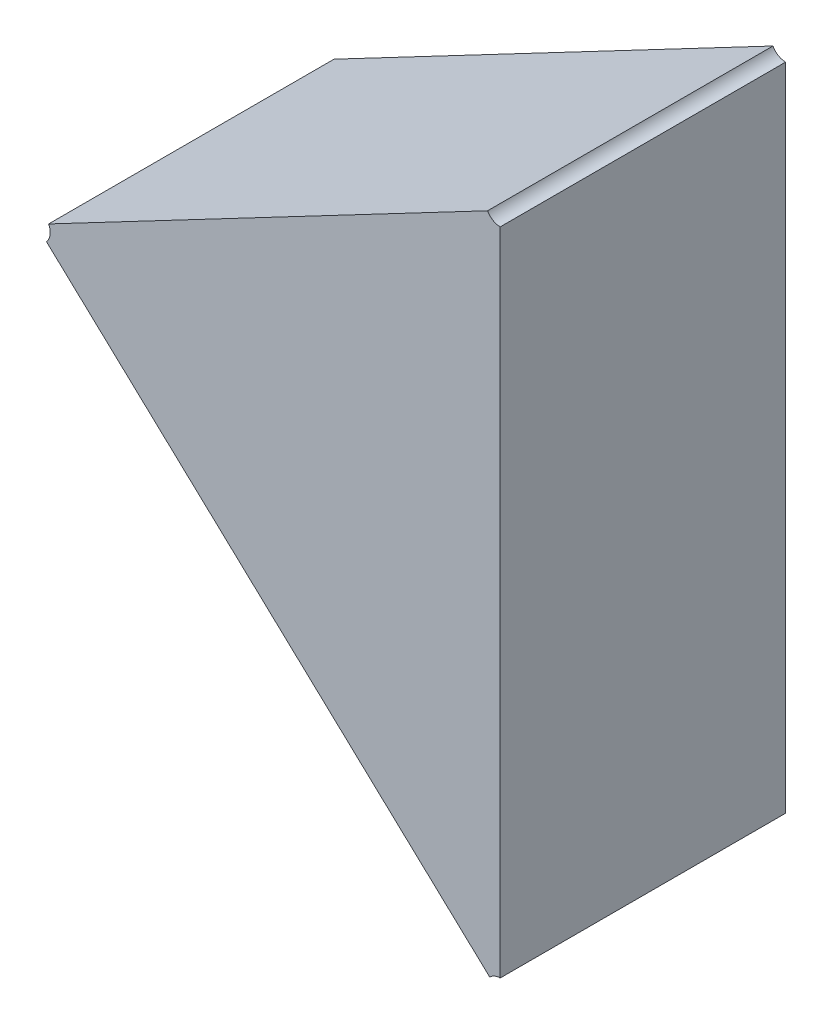
ISO-10303-21;
HEADER;
FILE_DESCRIPTION(('STEP AP214'),'2;1');
FILE_NAME('part.step','',(''),(''),'','','');
FILE_SCHEMA(('AUTOMOTIVE_DESIGN { 1 0 10303 214 1 1 1 1 }'));
ENDSEC;
DATA;
#1=APPLICATION_CONTEXT('core data for automotive mechanical design processes');
#2=APPLICATION_PROTOCOL_DEFINITION('international standard','automotive_design',2000,#1);
#3=PRODUCT_CONTEXT('',#1,'mechanical');
#4=PRODUCT('Part','Part','',(#3));
#5=PRODUCT_RELATED_PRODUCT_CATEGORY('part','',(#4));
#6=PRODUCT_DEFINITION_FORMATION('','',#4);
#7=PRODUCT_DEFINITION_CONTEXT('part definition',#1,'design');
#8=PRODUCT_DEFINITION('design','',#6,#7);
#9=PRODUCT_DEFINITION_SHAPE('','',#8);
#10=(LENGTH_UNIT() NAMED_UNIT(*) SI_UNIT(.MILLI.,.METRE.));
#11=(NAMED_UNIT(*) PLANE_ANGLE_UNIT() SI_UNIT($,.RADIAN.));
#12=(NAMED_UNIT(*) SI_UNIT($,.STERADIAN.) SOLID_ANGLE_UNIT());
#13=UNCERTAINTY_MEASURE_WITH_UNIT(LENGTH_MEASURE(1.E-05),#10,'distance_accuracy_value','');
#14=(GEOMETRIC_REPRESENTATION_CONTEXT(3) GLOBAL_UNCERTAINTY_ASSIGNED_CONTEXT((#13)) GLOBAL_UNIT_ASSIGNED_CONTEXT((#10,
#11,#12)) REPRESENTATION_CONTEXT('',''));
#15=CARTESIAN_POINT('',(0.,0.,0.));
#16=DIRECTION('',(0.,0.,1.));
#17=DIRECTION('',(1.,0.,0.));
#18=AXIS2_PLACEMENT_3D('',#15,#16,#17);
#19=CARTESIAN_POINT('',(-1.427617368665,-0.918561701377886,0.));
#20=DIRECTION('',(0.,0.,1.));
#21=DIRECTION('',(1.,0.,0.));
#22=AXIS2_PLACEMENT_3D('',#19,#20,#21);
#23=PLANE('',#22);
#24=CARTESIAN_POINT('',(-1.376302875285,-0.806521766430921,0.));
#25=DIRECTION('',(0.,0.,1.));
#26=DIRECTION('',(-1.,0.,0.));
#27=AXIS2_PLACEMENT_3D('',#24,#25,#26);
#28=CIRCLE('',#27,0.00500000000000005);
#29=CARTESIAN_POINT('',(-1.380728072623,-0.808849346400258,0.));
#30=VERTEX_POINT('',#29);
#31=CARTESIAN_POINT('',(-1.376302875285,-0.811521766430921,0.));
#32=VERTEX_POINT('',#31);
#33=EDGE_CURVE('E11',#30,#32,#28,.T.);
#34=ORIENTED_EDGE('',*,*,#33,.T.);
#35=DIRECTION('',(0.,1.,0.));
#36=VECTOR('',#35,1.);
#37=CARTESIAN_POINT('',(-1.376302875285,-1.044463865233,0.));
#38=LINE('',#37,#36);
#39=CARTESIAN_POINT('',(-1.376302875285,-1.039463865233,0.));
#40=VERTEX_POINT('',#39);
#41=EDGE_CURVE('E24',#40,#32,#38,.T.);
#42=ORIENTED_EDGE('',*,*,#41,.F.);
#43=CARTESIAN_POINT('',(-1.376302875285,-1.044463865233,0.));
#44=DIRECTION('',(0.,0.,1.));
#45=DIRECTION('',(-1.,0.,0.));
#46=AXIS2_PLACEMENT_3D('',#43,#44,#45);
#47=CIRCLE('',#46,0.00500000000000005);
#48=CARTESIAN_POINT('',(-1.379951984519,-1.041045678316,0.));
#49=VERTEX_POINT('',#48);
#50=EDGE_CURVE('E87',#40,#49,#47,.T.);
#51=ORIENTED_EDGE('',*,*,#50,.T.);
#52=DIRECTION('',(0.729821846781321,-0.683637383384425,0.));
#53=VECTOR('',#52,1.);
#54=CARTESIAN_POINT('',(-1.538975916512,-0.892085072049242,0.));
#55=LINE('',#54,#53);
#56=CARTESIAN_POINT('',(-1.535326807278,-0.895503258966164,0.));
#57=VERTEX_POINT('',#56);
#58=EDGE_CURVE('E113',#57,#49,#55,.T.);
#59=ORIENTED_EDGE('',*,*,#58,.F.);
#60=CARTESIAN_POINT('',(-1.538975916512,-0.892085072049242,0.));
#61=DIRECTION('',(0.,0.,1.));
#62=DIRECTION('',(-1.,0.,0.));
#63=AXIS2_PLACEMENT_3D('',#60,#61,#62);
#64=CIRCLE('',#63,0.00500000000000004);
#65=CARTESIAN_POINT('',(-1.534550719173,-0.889757492079906,0.));
#66=VERTEX_POINT('',#65);
#67=EDGE_CURVE('E111',#57,#66,#64,.T.);
#68=ORIENTED_EDGE('',*,*,#67,.T.);
#69=DIRECTION('',(-0.885039467737862,-0.465515993867324,0.));
#70=VECTOR('',#69,1.);
#71=CARTESIAN_POINT('',(-1.376302875285,-0.806521766430921,0.));
#72=LINE('',#71,#70);
#73=EDGE_CURVE('E108',#30,#66,#72,.T.);
#74=ORIENTED_EDGE('',*,*,#73,.F.);
#75=EDGE_LOOP('',(#34,#42,#51,#59,#68,#74));
#76=FACE_BOUND('',#75,.T.);
#77=ADVANCED_FACE('F17',(#76),#23,.F.);
#78=CARTESIAN_POINT('',(-1.376302875285,-0.806521766430921,0.));
#79=DIRECTION('',(-0.465515993867324,0.885039467737862,0.));
#80=DIRECTION('',(-0.885039467737862,-0.465515993867324,0.));
#81=AXIS2_PLACEMENT_3D('',#78,#79,#80);
#82=PLANE('',#81);
#83=DIRECTION('',(0.,0.,-1.));
#84=VECTOR('',#83,1.);
#85=CARTESIAN_POINT('',(-1.380728072623,-0.808849346400258,0.1));
#86=LINE('',#85,#84);
#87=CARTESIAN_POINT('',(-1.380728072623,-0.808849346400258,0.1));
#88=VERTEX_POINT('',#87);
#89=EDGE_CURVE('E105',#88,#30,#86,.T.);
#90=ORIENTED_EDGE('',*,*,#89,.T.);
#91=ORIENTED_EDGE('',*,*,#73,.T.);
#92=DIRECTION('',(0.,0.,1.));
#93=VECTOR('',#92,1.);
#94=CARTESIAN_POINT('',(-1.534550719173,-0.889757492079906,0.1));
#95=LINE('',#94,#93);
#96=CARTESIAN_POINT('',(-1.534550719173,-0.889757492079906,0.1));
#97=VERTEX_POINT('',#96);
#98=EDGE_CURVE('E103',#66,#97,#95,.T.);
#99=ORIENTED_EDGE('',*,*,#98,.T.);
#100=DIRECTION('',(-0.885039467737862,-0.465515993867324,0.));
#101=VECTOR('',#100,1.);
#102=CARTESIAN_POINT('',(-1.376302875285,-0.806521766430921,0.1));
#103=LINE('',#102,#101);
#104=EDGE_CURVE('E100',#88,#97,#103,.T.);
#105=ORIENTED_EDGE('',*,*,#104,.F.);
#106=EDGE_LOOP('',(#90,#91,#99,#105));
#107=FACE_BOUND('',#106,.T.);
#108=ADVANCED_FACE('F127',(#107),#82,.T.);
#109=CARTESIAN_POINT('',(-1.538975916512,-0.892085072049242,0.));
#110=DIRECTION('',(-0.683637383384425,-0.729821846781321,0.));
#111=DIRECTION('',(0.729821846781321,-0.683637383384425,0.));
#112=AXIS2_PLACEMENT_3D('',#109,#110,#111);
#113=PLANE('',#112);
#114=DIRECTION('',(0.,0.,1.));
#115=VECTOR('',#114,1.);
#116=CARTESIAN_POINT('',(-1.379951984519,-1.041045678316,0.1));
#117=LINE('',#116,#115);
#118=CARTESIAN_POINT('',(-1.379951984519,-1.041045678316,0.1));
#119=VERTEX_POINT('',#118);
#120=EDGE_CURVE('E98',#49,#119,#117,.T.);
#121=ORIENTED_EDGE('',*,*,#120,.T.);
#122=DIRECTION('',(0.729821846781321,-0.683637383384425,0.));
#123=VECTOR('',#122,1.);
#124=CARTESIAN_POINT('',(-1.538975916512,-0.892085072049242,0.1));
#125=LINE('',#124,#123);
#126=CARTESIAN_POINT('',(-1.535326807278,-0.895503258966164,0.1));
#127=VERTEX_POINT('',#126);
#128=EDGE_CURVE('E73',#127,#119,#125,.T.);
#129=ORIENTED_EDGE('',*,*,#128,.F.);
#130=DIRECTION('',(0.,0.,-1.));
#131=VECTOR('',#130,1.);
#132=CARTESIAN_POINT('',(-1.535326807278,-0.895503258966164,0.1));
#133=LINE('',#132,#131);
#134=EDGE_CURVE('E94',#127,#57,#133,.T.);
#135=ORIENTED_EDGE('',*,*,#134,.T.);
#136=ORIENTED_EDGE('',*,*,#58,.T.);
#137=EDGE_LOOP('',(#121,#129,#135,#136));
#138=FACE_BOUND('',#137,.T.);
#139=ADVANCED_FACE('F126',(#138),#113,.T.);
#140=CARTESIAN_POINT('',(-1.427617368665,-0.918561701377886,0.1));
#141=DIRECTION('',(0.,0.,1.));
#142=DIRECTION('',(1.,0.,0.));
#143=AXIS2_PLACEMENT_3D('',#140,#141,#142);
#144=PLANE('',#143);
#145=CARTESIAN_POINT('',(-1.376302875285,-0.806521766430921,0.1));
#146=DIRECTION('',(0.,0.,-1.));
#147=DIRECTION('',(-1.,0.,0.));
#148=AXIS2_PLACEMENT_3D('',#145,#146,#147);
#149=CIRCLE('',#148,0.00500000000000005);
#150=CARTESIAN_POINT('',(-1.376302875285,-0.811521766430921,0.1));
#151=VERTEX_POINT('',#150);
#152=EDGE_CURVE('E92',#151,#88,#149,.T.);
#153=ORIENTED_EDGE('',*,*,#152,.T.);
#154=ORIENTED_EDGE('',*,*,#104,.T.);
#155=CARTESIAN_POINT('',(-1.538975916512,-0.892085072049242,0.1));
#156=DIRECTION('',(0.,0.,-1.));
#157=DIRECTION('',(-1.,0.,0.));
#158=AXIS2_PLACEMENT_3D('',#155,#156,#157);
#159=CIRCLE('',#158,0.00500000000000004);
#160=EDGE_CURVE('E77',#97,#127,#159,.T.);
#161=ORIENTED_EDGE('',*,*,#160,.T.);
#162=ORIENTED_EDGE('',*,*,#128,.T.);
#163=CARTESIAN_POINT('',(-1.376302875285,-1.044463865233,0.1));
#164=DIRECTION('',(0.,0.,-1.));
#165=DIRECTION('',(-1.,0.,0.));
#166=AXIS2_PLACEMENT_3D('',#163,#164,#165);
#167=CIRCLE('',#166,0.00500000000000005);
#168=CARTESIAN_POINT('',(-1.376302875285,-1.039463865233,0.1));
#169=VERTEX_POINT('',#168);
#170=EDGE_CURVE('E66',#119,#169,#167,.T.);
#171=ORIENTED_EDGE('',*,*,#170,.T.);
#172=DIRECTION('',(0.,1.,0.));
#173=VECTOR('',#172,1.);
#174=CARTESIAN_POINT('',(-1.376302875285,-1.044463865233,0.1));
#175=LINE('',#174,#173);
#176=EDGE_CURVE('E70',#169,#151,#175,.T.);
#177=ORIENTED_EDGE('',*,*,#176,.T.);
#178=EDGE_LOOP('',(#153,#154,#161,#162,#171,#177));
#179=FACE_BOUND('',#178,.T.);
#180=ADVANCED_FACE('F69',(#179),#144,.T.);
#181=CARTESIAN_POINT('',(-1.376302875285,-1.044463865233,0.));
#182=DIRECTION('',(1.,0.,0.));
#183=DIRECTION('',(0.,1.,0.));
#184=AXIS2_PLACEMENT_3D('',#181,#182,#183);
#185=PLANE('',#184);
#186=DIRECTION('',(0.,0.,1.));
#187=VECTOR('',#186,1.);
#188=CARTESIAN_POINT('',(-1.376302875285,-0.811521766430921,0.1));
#189=LINE('',#188,#187);
#190=EDGE_CURVE('E83',#32,#151,#189,.T.);
#191=ORIENTED_EDGE('',*,*,#190,.T.);
#192=ORIENTED_EDGE('',*,*,#176,.F.);
#193=DIRECTION('',(0.,0.,-1.));
#194=VECTOR('',#193,1.);
#195=CARTESIAN_POINT('',(-1.376302875285,-1.039463865233,0.1));
#196=LINE('',#195,#194);
#197=EDGE_CURVE('E82',#169,#40,#196,.T.);
#198=ORIENTED_EDGE('',*,*,#197,.T.);
#199=ORIENTED_EDGE('',*,*,#41,.T.);
#200=EDGE_LOOP('',(#191,#192,#198,#199));
#201=FACE_BOUND('',#200,.T.);
#202=ADVANCED_FACE('F81',(#201),#185,.T.);
#203=CARTESIAN_POINT('',(-1.538975916512,-0.892085072049242,0.1));
#204=DIRECTION('',(0.,0.,1.));
#205=DIRECTION('',(-1.,0.,0.));
#206=AXIS2_PLACEMENT_3D('',#203,#204,#205);
#207=CYLINDRICAL_SURFACE('',#206,0.00500000000000004);
#208=ORIENTED_EDGE('',*,*,#98,.F.);
#209=ORIENTED_EDGE('',*,*,#67,.F.);
#210=ORIENTED_EDGE('',*,*,#134,.F.);
#211=ORIENTED_EDGE('',*,*,#160,.F.);
#212=EDGE_LOOP('',(#208,#209,#210,#211));
#213=FACE_BOUND('',#212,.T.);
#214=ADVANCED_FACE('F123',(#213),#207,.F.);
#215=CARTESIAN_POINT('',(-1.376302875285,-1.044463865233,0.1));
#216=DIRECTION('',(0.,0.,1.));
#217=DIRECTION('',(-1.,0.,0.));
#218=AXIS2_PLACEMENT_3D('',#215,#216,#217);
#219=CYLINDRICAL_SURFACE('',#218,0.00500000000000005);
#220=ORIENTED_EDGE('',*,*,#120,.F.);
#221=ORIENTED_EDGE('',*,*,#50,.F.);
#222=ORIENTED_EDGE('',*,*,#197,.F.);
#223=ORIENTED_EDGE('',*,*,#170,.F.);
#224=EDGE_LOOP('',(#220,#221,#222,#223));
#225=FACE_BOUND('',#224,.T.);
#226=ADVANCED_FACE('F86',(#225),#219,.F.);
#227=CARTESIAN_POINT('',(-1.376302875285,-0.806521766430921,0.1));
#228=DIRECTION('',(0.,0.,1.));
#229=DIRECTION('',(-1.,0.,0.));
#230=AXIS2_PLACEMENT_3D('',#227,#228,#229);
#231=CYLINDRICAL_SURFACE('',#230,0.00500000000000005);
#232=ORIENTED_EDGE('',*,*,#89,.F.);
#233=ORIENTED_EDGE('',*,*,#152,.F.);
#234=ORIENTED_EDGE('',*,*,#190,.F.);
#235=ORIENTED_EDGE('',*,*,#33,.F.);
#236=EDGE_LOOP('',(#232,#233,#234,#235));
#237=FACE_BOUND('',#236,.T.);
#238=ADVANCED_FACE('F116',(#237),#231,.F.);
#239=CLOSED_SHELL('',(#77,#108,#139,#180,#202,#214,#226,#238));
#240=MANIFOLD_SOLID_BREP('B1',#239);
#241=ADVANCED_BREP_SHAPE_REPRESENTATION('',(#18,#240),#14);
#242=SHAPE_DEFINITION_REPRESENTATION(#9,#241);
ENDSEC;
END-ISO-10303-21;
